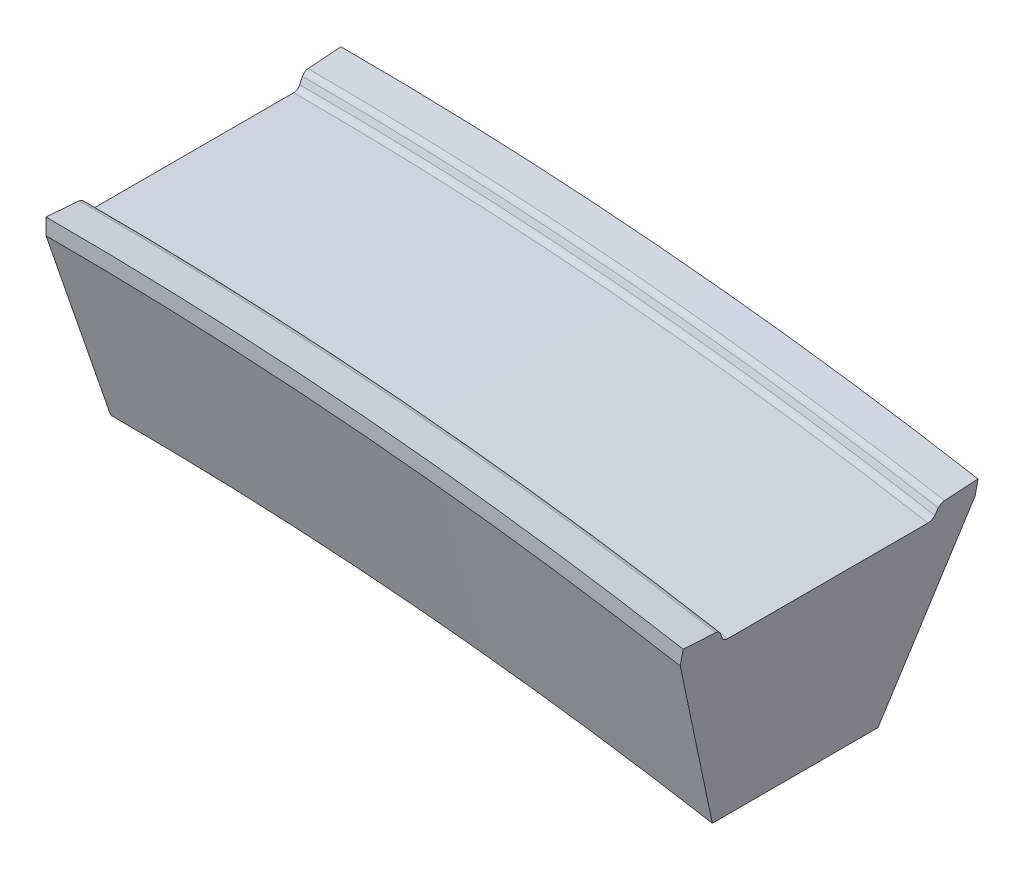
ISO-10303-21;
HEADER;
FILE_DESCRIPTION(('STEP AP214'),'2;1');
FILE_NAME('part.step','',(''),(''),'','','');
FILE_SCHEMA(('AUTOMOTIVE_DESIGN { 1 0 10303 214 1 1 1 1 }'));
ENDSEC;
DATA;
#1=APPLICATION_CONTEXT('core data for automotive mechanical design processes');
#2=APPLICATION_PROTOCOL_DEFINITION('international standard','automotive_design',2000,#1);
#3=PRODUCT_CONTEXT('',#1,'mechanical');
#4=PRODUCT('Part','Part','',(#3));
#5=PRODUCT_RELATED_PRODUCT_CATEGORY('part','',(#4));
#6=PRODUCT_DEFINITION_FORMATION('','',#4);
#7=PRODUCT_DEFINITION_CONTEXT('part definition',#1,'design');
#8=PRODUCT_DEFINITION('design','',#6,#7);
#9=PRODUCT_DEFINITION_SHAPE('','',#8);
#10=(LENGTH_UNIT() NAMED_UNIT(*) SI_UNIT(.MILLI.,.METRE.));
#11=(NAMED_UNIT(*) PLANE_ANGLE_UNIT() SI_UNIT($,.RADIAN.));
#12=(NAMED_UNIT(*) SI_UNIT($,.STERADIAN.) SOLID_ANGLE_UNIT());
#13=UNCERTAINTY_MEASURE_WITH_UNIT(LENGTH_MEASURE(1.E-05),#10,'distance_accuracy_value','');
#14=(GEOMETRIC_REPRESENTATION_CONTEXT(3) GLOBAL_UNCERTAINTY_ASSIGNED_CONTEXT((#13)) GLOBAL_UNIT_ASSIGNED_CONTEXT((#10,
#11,#12)) REPRESENTATION_CONTEXT('',''));
#15=CARTESIAN_POINT('',(0.,0.,0.));
#16=DIRECTION('',(0.,0.,1.));
#17=DIRECTION('',(1.,0.,0.));
#18=AXIS2_PLACEMENT_3D('',#15,#16,#17);
#19=CARTESIAN_POINT('',(0.,0.,11.));
#20=DIRECTION('',(0.,0.,1.));
#21=DIRECTION('',(0.,-1.,0.));
#22=AXIS2_PLACEMENT_3D('',#19,#20,#21);
#23=PLANE('',#22);
#24=CARTESIAN_POINT('',(0.,0.,11.));
#25=DIRECTION('',(0.,0.,1.));
#26=DIRECTION('',(0.,-1.,0.));
#27=AXIS2_PLACEMENT_3D('',#24,#25,#26);
#28=CIRCLE('',#27,272.5);
#29=CARTESIAN_POINT('',(47.3191284142386,268.360112695827,11.0000000000001));
#30=VERTEX_POINT('',#29);
#31=CARTESIAN_POINT('',(0.,272.5,11.0000000000001));
#32=VERTEX_POINT('',#31);
#33=EDGE_CURVE('E11',#30,#32,#28,.T.);
#34=ORIENTED_EDGE('',*,*,#33,.F.);
#35=DIRECTION('',(0.173648177666931,0.984807753012208,0.));
#36=VECTOR('',#35,1.);
#37=CARTESIAN_POINT('',(0.,0.,11.0000000000001));
#38=LINE('',#37,#36);
#39=CARTESIAN_POINT('',(47.5295098602582,269.553245165822,11.0000000000001));
#40=VERTEX_POINT('',#39);
#41=EDGE_CURVE('E196',#30,#40,#38,.T.);
#42=ORIENTED_EDGE('',*,*,#41,.T.);
#43=CARTESIAN_POINT('',(0.,0.,11.));
#44=DIRECTION('',(0.,0.,1.));
#45=DIRECTION('',(0.,-1.,0.));
#46=AXIS2_PLACEMENT_3D('',#43,#44,#45);
#47=CIRCLE('',#46,273.711538461538);
#48=CARTESIAN_POINT('',(0.,273.711538461538,11.0000000000001));
#49=VERTEX_POINT('',#48);
#50=EDGE_CURVE('E58',#40,#49,#47,.T.);
#51=ORIENTED_EDGE('',*,*,#50,.T.);
#52=DIRECTION('',(0.,1.,0.));
#53=VECTOR('',#52,1.);
#54=CARTESIAN_POINT('',(0.,0.,11.0000000000001));
#55=LINE('',#54,#53);
#56=EDGE_CURVE('E154',#32,#49,#55,.T.);
#57=ORIENTED_EDGE('',*,*,#56,.F.);
#58=EDGE_LOOP('',(#34,#42,#51,#57));
#59=FACE_BOUND('',#58,.T.);
#60=ADVANCED_FACE('F43',(#59),#23,.T.);
#61=CARTESIAN_POINT('',(0.,0.,11.));
#62=DIRECTION('',(0.,0.,1.));
#63=DIRECTION('',(0.,-1.,0.));
#64=AXIS2_PLACEMENT_3D('',#61,#62,#63);
#65=CONICAL_SURFACE('',#64,272.5,1.23918376891597);
#66=CARTESIAN_POINT('',(0.,0.,6.17941341394468));
#67=DIRECTION('',(0.,0.,1.));
#68=DIRECTION('',(0.,-1.,0.));
#69=AXIS2_PLACEMENT_3D('',#66,#67,#68);
#70=CIRCLE('',#69,258.5);
#71=CARTESIAN_POINT('',(44.8880539269016,254.572804153656,6.17941341394473));
#72=VERTEX_POINT('',#71);
#73=CARTESIAN_POINT('',(0.,258.5,6.17941341394473));
#74=VERTEX_POINT('',#73);
#75=EDGE_CURVE('E51',#72,#74,#70,.T.);
#76=ORIENTED_EDGE('',*,*,#75,.F.);
#77=DIRECTION('',(-0.164187577603053,-0.931154023867266,-0.325568154457159));
#78=VECTOR('',#77,1.);
#79=CARTESIAN_POINT('',(4.42757647338544,25.110033958478,-74.0498168682843));
#80=LINE('',#79,#78);
#81=EDGE_CURVE('E150',#30,#72,#80,.T.);
#82=ORIENTED_EDGE('',*,*,#81,.F.);
#83=ORIENTED_EDGE('',*,*,#33,.T.);
#84=DIRECTION('',(0.,-0.945518575599316,-0.325568154457159));
#85=VECTOR('',#84,1.);
#86=CARTESIAN_POINT('',(0.,25.4973967067933,-74.0498168682843));
#87=LINE('',#86,#85);
#88=EDGE_CURVE('E147',#32,#74,#87,.T.);
#89=ORIENTED_EDGE('',*,*,#88,.T.);
#90=EDGE_LOOP('',(#76,#82,#83,#89));
#91=FACE_BOUND('',#90,.T.);
#92=ADVANCED_FACE('F45',(#91),#65,.F.);
#93=CARTESIAN_POINT('',(0.,0.,417.631684513944));
#94=DIRECTION('',(0.,0.,1.));
#95=DIRECTION('',(0.,-1.,0.));
#96=AXIS2_PLACEMENT_3D('',#93,#94,#95);
#97=CYLINDRICAL_SURFACE('',#96,258.5);
#98=CARTESIAN_POINT('',(0.,0.,-6.17941341394479));
#99=DIRECTION('',(0.,0.,1.));
#100=DIRECTION('',(0.,-1.,0.));
#101=AXIS2_PLACEMENT_3D('',#98,#99,#100);
#102=CIRCLE('',#101,258.5);
#103=CARTESIAN_POINT('',(44.8880539269016,254.572804153656,-6.17941341394476));
#104=VERTEX_POINT('',#103);
#105=CARTESIAN_POINT('',(0.,258.5,-6.17941341394476));
#106=VERTEX_POINT('',#105);
#107=EDGE_CURVE('E254',#104,#106,#102,.T.);
#108=ORIENTED_EDGE('',*,*,#107,.F.);
#109=DIRECTION('',(0.,0.,-1.));
#110=VECTOR('',#109,1.);
#111=CARTESIAN_POINT('',(44.8880539269016,254.572804153656,0.));
#112=LINE('',#111,#110);
#113=EDGE_CURVE('E199',#72,#104,#112,.T.);
#114=ORIENTED_EDGE('',*,*,#113,.F.);
#115=ORIENTED_EDGE('',*,*,#75,.T.);
#116=DIRECTION('',(0.,0.,-1.));
#117=VECTOR('',#116,1.);
#118=CARTESIAN_POINT('',(0.,258.5,0.));
#119=LINE('',#118,#117);
#120=EDGE_CURVE('E161',#74,#106,#119,.T.);
#121=ORIENTED_EDGE('',*,*,#120,.T.);
#122=EDGE_LOOP('',(#108,#114,#115,#121));
#123=FACE_BOUND('',#122,.T.);
#124=ADVANCED_FACE('F257',(#123),#97,.F.);
#125=CARTESIAN_POINT('',(0.,0.,-6.17941341394479));
#126=DIRECTION('',(0.,0.,-1.));
#127=DIRECTION('',(0.,1.,0.));
#128=AXIS2_PLACEMENT_3D('',#125,#126,#127);
#129=CONICAL_SURFACE('',#128,258.5,1.23918376891598);
#130=CARTESIAN_POINT('',(0.,0.,-11.));
#131=DIRECTION('',(0.,0.,1.));
#132=DIRECTION('',(0.,-1.,0.));
#133=AXIS2_PLACEMENT_3D('',#130,#131,#132);
#134=CIRCLE('',#133,272.5);
#135=CARTESIAN_POINT('',(47.3191284142386,268.360112695827,-10.9999999999999));
#136=VERTEX_POINT('',#135);
#137=CARTESIAN_POINT('',(0.,272.5,-10.9999999999999));
#138=VERTEX_POINT('',#137);
#139=EDGE_CURVE('E252',#136,#138,#134,.T.);
#140=ORIENTED_EDGE('',*,*,#139,.F.);
#141=DIRECTION('',(0.164187577603054,0.93115402386727,-0.325568154457147));
#142=VECTOR('',#141,1.);
#143=CARTESIAN_POINT('',(4.42757647338512,25.1100339584761,74.0498168682818));
#144=LINE('',#143,#142);
#145=EDGE_CURVE('E202',#104,#136,#144,.T.);
#146=ORIENTED_EDGE('',*,*,#145,.F.);
#147=ORIENTED_EDGE('',*,*,#107,.T.);
#148=DIRECTION('',(0.,0.94551857559932,-0.325568154457147));
#149=VECTOR('',#148,1.);
#150=CARTESIAN_POINT('',(0.,25.4973967067914,74.0498168682818));
#151=LINE('',#150,#149);
#152=EDGE_CURVE('E163',#106,#138,#151,.T.);
#153=ORIENTED_EDGE('',*,*,#152,.T.);
#154=EDGE_LOOP('',(#140,#146,#147,#153));
#155=FACE_BOUND('',#154,.T.);
#156=ADVANCED_FACE('F297',(#155),#129,.F.);
#157=CARTESIAN_POINT('',(0.,0.,-11.));
#158=DIRECTION('',(0.,0.,1.));
#159=DIRECTION('',(0.,-1.,0.));
#160=AXIS2_PLACEMENT_3D('',#157,#158,#159);
#161=PLANE('',#160);
#162=CARTESIAN_POINT('',(0.,0.,-11.));
#163=DIRECTION('',(0.,0.,1.));
#164=DIRECTION('',(0.,-1.,0.));
#165=AXIS2_PLACEMENT_3D('',#162,#163,#164);
#166=CIRCLE('',#165,273.711538461538);
#167=CARTESIAN_POINT('',(47.5295098602581,269.553245165822,-10.9999999999999));
#168=VERTEX_POINT('',#167);
#169=CARTESIAN_POINT('',(0.,273.711538461538,-10.9999999999999));
#170=VERTEX_POINT('',#169);
#171=EDGE_CURVE('E250',#168,#170,#166,.T.);
#172=ORIENTED_EDGE('',*,*,#171,.F.);
#173=DIRECTION('',(0.173648177666931,0.984807753012208,0.));
#174=VECTOR('',#173,1.);
#175=CARTESIAN_POINT('',(0.,0.,-10.9999999999999));
#176=LINE('',#175,#174);
#177=EDGE_CURVE('E205',#136,#168,#176,.T.);
#178=ORIENTED_EDGE('',*,*,#177,.F.);
#179=ORIENTED_EDGE('',*,*,#139,.T.);
#180=DIRECTION('',(0.,1.,0.));
#181=VECTOR('',#180,1.);
#182=CARTESIAN_POINT('',(0.,0.,-10.9999999999999));
#183=LINE('',#182,#181);
#184=EDGE_CURVE('E168',#138,#170,#183,.T.);
#185=ORIENTED_EDGE('',*,*,#184,.T.);
#186=EDGE_LOOP('',(#172,#178,#179,#185));
#187=FACE_BOUND('',#186,.T.);
#188=ADVANCED_FACE('F295',(#187),#161,.F.);
#189=CARTESIAN_POINT('',(0.,0.,-8.5458481953769));
#190=DIRECTION('',(0.,0.,-1.));
#191=DIRECTION('',(0.,1.,0.));
#192=AXIS2_PLACEMENT_3D('',#189,#190,#191);
#193=CONICAL_SURFACE('',#192,273.52275755349,0.0767718912698178);
#194=CARTESIAN_POINT('',(0.,0.,-8.5458481953769));
#195=DIRECTION('',(0.,0.,1.));
#196=DIRECTION('',(0.,-1.,0.));
#197=AXIS2_PLACEMENT_3D('',#194,#195,#196);
#198=CIRCLE('',#197,273.52275755349);
#199=CARTESIAN_POINT('',(47.4967283995973,269.367332263956,-8.54584819537685));
#200=VERTEX_POINT('',#199);
#201=CARTESIAN_POINT('',(0.,273.52275755349,-8.54584819537685));
#202=VERTEX_POINT('',#201);
#203=EDGE_CURVE('E248',#200,#202,#198,.T.);
#204=ORIENTED_EDGE('',*,*,#203,.F.);
#205=DIRECTION('',(0.0133182072647713,0.0755313067305977,-0.99705448550158));
#206=VECTOR('',#205,1.);
#207=CARTESIAN_POINT('',(47.1038557469249,267.13924073143,20.8661764705928));
#208=LINE('',#207,#206);
#209=EDGE_CURVE('E208',#200,#168,#208,.T.);
#210=ORIENTED_EDGE('',*,*,#209,.T.);
#211=ORIENTED_EDGE('',*,*,#171,.T.);
#212=DIRECTION('',(0.,0.0766964988847538,-0.99705448550158));
#213=VECTOR('',#212,1.);
#214=CARTESIAN_POINT('',(0.,271.260294117646,20.8661764705928));
#215=LINE('',#214,#213);
#216=EDGE_CURVE('E171',#202,#170,#215,.T.);
#217=ORIENTED_EDGE('',*,*,#216,.F.);
#218=EDGE_LOOP('',(#204,#210,#211,#217));
#219=FACE_BOUND('',#218,.T.);
#220=ADVANCED_FACE('F291',(#219),#193,.T.);
#221=CARTESIAN_POINT('',(0.,0.,-8.58419644481927));
#222=DIRECTION('',(0.,0.,1.));
#223=DIRECTION('',(0.,-1.,0.));
#224=AXIS2_PLACEMENT_3D('',#221,#222,#223);
#225=TOROIDAL_SURFACE('',#224,273.02423031074,0.499999999999952);
#226=CARTESIAN_POINT('',(0.,0.,-8.1282356922317));
#227=DIRECTION('',(0.,0.,1.));
#228=DIRECTION('',(0.,-1.,0.));
#229=AXIS2_PLACEMENT_3D('',#226,#227,#228);
#230=CIRCLE('',#229,273.229412649404);
#231=CARTESIAN_POINT('',(47.4457895915748,269.078443928105,-8.12823569223166));
#232=VERTEX_POINT('',#231);
#233=CARTESIAN_POINT('',(0.,273.229412649404,-8.12823569223166));
#234=VERTEX_POINT('',#233);
#235=EDGE_CURVE('E246',#232,#234,#230,.T.);
#236=ORIENTED_EDGE('',*,*,#235,.F.);
#237=CARTESIAN_POINT('',(47.4101600523763,268.876378770207,-8.58419644481921));
#238=DIRECTION('',(0.984807753012208,-0.173648177666931,0.));
#239=DIRECTION('',(0.,0.,-1.));
#240=AXIS2_PLACEMENT_3D('',#237,#238,#239);
#241=CIRCLE('',#240,0.499999999999952);
#242=EDGE_CURVE('E211',#200,#232,#241,.T.);
#243=ORIENTED_EDGE('',*,*,#242,.F.);
#244=ORIENTED_EDGE('',*,*,#203,.T.);
#245=CARTESIAN_POINT('',(0.,273.02423031074,-8.58419644481921));
#246=DIRECTION('',(1.,0.,0.));
#247=DIRECTION('',(0.,0.,-1.));
#248=AXIS2_PLACEMENT_3D('',#245,#246,#247);
#249=CIRCLE('',#248,0.499999999999952);
#250=EDGE_CURVE('E174',#202,#234,#249,.T.);
#251=ORIENTED_EDGE('',*,*,#250,.T.);
#252=EDGE_LOOP('',(#236,#243,#244,#251));
#253=FACE_BOUND('',#252,.T.);
#254=ADVANCED_FACE('F287',(#253),#225,.T.);
#255=CARTESIAN_POINT('',(0.,0.,-7.93266794760089));
#256=DIRECTION('',(0.,0.,-1.));
#257=DIRECTION('',(0.,1.,0.));
#258=AXIS2_PLACEMENT_3D('',#255,#256,#257);
#259=CONICAL_SURFACE('',#258,272.794817661336,1.14794240066196);
#260=CARTESIAN_POINT('',(0.,0.,-7.93266794760089));
#261=DIRECTION('',(0.,0.,1.));
#262=DIRECTION('',(0.,-1.,0.));
#263=AXIS2_PLACEMENT_3D('',#260,#261,#262);
#264=CIRCLE('',#263,272.794817661336);
#265=CARTESIAN_POINT('',(47.3703229638736,268.650451414435,-7.93266794760085));
#266=VERTEX_POINT('',#265);
#267=CARTESIAN_POINT('',(0.,272.794817661336,-7.93266794760085));
#268=VERTEX_POINT('',#267);
#269=EDGE_CURVE('E244',#266,#268,#264,.T.);
#270=ORIENTED_EDGE('',*,*,#269,.F.);
#271=DIRECTION('',(0.158353507548941,0.898067368435002,-0.41036467732881));
#272=VECTOR('',#271,1.);
#273=CARTESIAN_POINT('',(7.46163692330391,42.3170458277216,95.4885654885681));
#274=LINE('',#273,#272);
#275=EDGE_CURVE('E214',#266,#232,#274,.T.);
#276=ORIENTED_EDGE('',*,*,#275,.T.);
#277=ORIENTED_EDGE('',*,*,#235,.T.);
#278=DIRECTION('',(0.,0.911921505175101,-0.41036467732881));
#279=VECTOR('',#278,1.);
#280=CARTESIAN_POINT('',(0.,42.9698544698572,95.4885654885681));
#281=LINE('',#280,#279);
#282=EDGE_CURVE('E177',#268,#234,#281,.T.);
#283=ORIENTED_EDGE('',*,*,#282,.F.);
#284=EDGE_LOOP('',(#270,#276,#277,#283));
#285=FACE_BOUND('',#284,.T.);
#286=ADVANCED_FACE('F284',(#285),#259,.T.);
#287=CARTESIAN_POINT('',(0.,0.,-7.47670719501332));
#288=DIRECTION('',(0.,0.,1.));
#289=DIRECTION('',(0.,-1.,0.));
#290=AXIS2_PLACEMENT_3D('',#287,#288,#289);
#291=TOROIDAL_SURFACE('',#290,273.,0.500000000000009);
#292=CARTESIAN_POINT('',(0.,0.,-7.47670719501337));
#293=DIRECTION('',(0.,0.,1.));
#294=DIRECTION('',(0.,-1.,0.));
#295=AXIS2_PLACEMENT_3D('',#292,#293,#294);
#296=CIRCLE('',#295,272.5);
#297=CARTESIAN_POINT('',(47.3191284142386,268.360112695827,-7.47670719501329));
#298=VERTEX_POINT('',#297);
#299=CARTESIAN_POINT('',(0.,272.5,-7.47670719501329));
#300=VERTEX_POINT('',#299);
#301=EDGE_CURVE('E242',#298,#300,#296,.T.);
#302=ORIENTED_EDGE('',*,*,#301,.F.);
#303=CARTESIAN_POINT('',(47.4059525030721,268.852516572333,-7.47670719501326));
#304=DIRECTION('',(0.984807753012208,-0.173648177666931,0.));
#305=DIRECTION('',(0.,0.,-1.));
#306=AXIS2_PLACEMENT_3D('',#303,#304,#305);
#307=CIRCLE('',#306,0.500000000000009);
#308=EDGE_CURVE('E217',#298,#266,#307,.T.);
#309=ORIENTED_EDGE('',*,*,#308,.T.);
#310=ORIENTED_EDGE('',*,*,#269,.T.);
#311=CARTESIAN_POINT('',(0.,273.,-7.47670719501326));
#312=DIRECTION('',(1.,0.,0.));
#313=DIRECTION('',(0.,0.,-1.));
#314=AXIS2_PLACEMENT_3D('',#311,#312,#313);
#315=CIRCLE('',#314,0.500000000000009);
#316=EDGE_CURVE('E180',#300,#268,#315,.T.);
#317=ORIENTED_EDGE('',*,*,#316,.F.);
#318=EDGE_LOOP('',(#302,#309,#310,#317));
#319=FACE_BOUND('',#318,.T.);
#320=ADVANCED_FACE('F280',(#319),#291,.F.);
#321=CARTESIAN_POINT('',(0.,0.,417.631684513944));
#322=DIRECTION('',(0.,0.,1.));
#323=DIRECTION('',(0.,-1.,0.));
#324=AXIS2_PLACEMENT_3D('',#321,#322,#323);
#325=CYLINDRICAL_SURFACE('',#324,272.5);
#326=CARTESIAN_POINT('',(0.,0.,7.47670719501342));
#327=DIRECTION('',(0.,0.,1.));
#328=DIRECTION('',(0.,-1.,0.));
#329=AXIS2_PLACEMENT_3D('',#326,#327,#328);
#330=CIRCLE('',#329,272.5);
#331=CARTESIAN_POINT('',(47.3191284142386,268.360112695827,7.47670719501345));
#332=VERTEX_POINT('',#331);
#333=CARTESIAN_POINT('',(0.,272.5,7.47670719501345));
#334=VERTEX_POINT('',#333);
#335=EDGE_CURVE('E240',#332,#334,#330,.T.);
#336=ORIENTED_EDGE('',*,*,#335,.F.);
#337=DIRECTION('',(0.,0.,-1.));
#338=VECTOR('',#337,1.);
#339=CARTESIAN_POINT('',(47.3191284142386,268.360112695827,0.));
#340=LINE('',#339,#338);
#341=EDGE_CURVE('E220',#332,#298,#340,.T.);
#342=ORIENTED_EDGE('',*,*,#341,.T.);
#343=ORIENTED_EDGE('',*,*,#301,.T.);
#344=DIRECTION('',(0.,0.,-1.));
#345=VECTOR('',#344,1.);
#346=CARTESIAN_POINT('',(0.,272.5,0.));
#347=LINE('',#346,#345);
#348=EDGE_CURVE('E183',#334,#300,#347,.T.);
#349=ORIENTED_EDGE('',*,*,#348,.F.);
#350=EDGE_LOOP('',(#336,#342,#343,#349));
#351=FACE_BOUND('',#350,.T.);
#352=ADVANCED_FACE('F275',(#351),#325,.T.);
#353=CARTESIAN_POINT('',(0.,0.,7.47670719501341));
#354=DIRECTION('',(0.,0.,1.));
#355=DIRECTION('',(0.,-1.,0.));
#356=AXIS2_PLACEMENT_3D('',#353,#354,#355);
#357=TOROIDAL_SURFACE('',#356,273.,0.500000000000002);
#358=CARTESIAN_POINT('',(0.,0.,7.932667947601));
#359=DIRECTION('',(0.,0.,1.));
#360=DIRECTION('',(0.,-1.,0.));
#361=AXIS2_PLACEMENT_3D('',#358,#359,#360);
#362=CIRCLE('',#361,272.794817661336);
#363=CARTESIAN_POINT('',(47.3703229638736,268.650451414435,7.93266794760104));
#364=VERTEX_POINT('',#363);
#365=CARTESIAN_POINT('',(0.,272.794817661336,7.93266794760104));
#366=VERTEX_POINT('',#365);
#367=EDGE_CURVE('E238',#364,#366,#362,.T.);
#368=ORIENTED_EDGE('',*,*,#367,.F.);
#369=CARTESIAN_POINT('',(47.4059525030721,268.852516572333,7.47670719501347));
#370=DIRECTION('',(0.984807753012208,-0.173648177666931,0.));
#371=DIRECTION('',(0.,0.,-1.));
#372=AXIS2_PLACEMENT_3D('',#369,#370,#371);
#373=CIRCLE('',#372,0.500000000000002);
#374=EDGE_CURVE('E223',#364,#332,#373,.T.);
#375=ORIENTED_EDGE('',*,*,#374,.T.);
#376=ORIENTED_EDGE('',*,*,#335,.T.);
#377=CARTESIAN_POINT('',(0.,273.,7.47670719501347));
#378=DIRECTION('',(1.,0.,0.));
#379=DIRECTION('',(0.,0.,-1.));
#380=AXIS2_PLACEMENT_3D('',#377,#378,#379);
#381=CIRCLE('',#380,0.500000000000002);
#382=EDGE_CURVE('E186',#366,#334,#381,.T.);
#383=ORIENTED_EDGE('',*,*,#382,.F.);
#384=EDGE_LOOP('',(#368,#375,#376,#383));
#385=FACE_BOUND('',#384,.T.);
#386=ADVANCED_FACE('F271',(#385),#357,.F.);
#387=CARTESIAN_POINT('',(0.,0.,7.932667947601));
#388=DIRECTION('',(0.,0.,1.));
#389=DIRECTION('',(0.,-1.,0.));
#390=AXIS2_PLACEMENT_3D('',#387,#388,#389);
#391=CONICAL_SURFACE('',#390,272.794817661336,1.14794240066192);
#392=CARTESIAN_POINT('',(0.,0.,8.12823569223175));
#393=DIRECTION('',(0.,0.,1.));
#394=DIRECTION('',(0.,-1.,0.));
#395=AXIS2_PLACEMENT_3D('',#392,#393,#394);
#396=CIRCLE('',#395,273.229412649404);
#397=CARTESIAN_POINT('',(47.4457895915748,269.078443928105,8.12823569223181));
#398=VERTEX_POINT('',#397);
#399=CARTESIAN_POINT('',(0.,273.229412649404,8.12823569223181));
#400=VERTEX_POINT('',#399);
#401=EDGE_CURVE('E236',#398,#400,#396,.T.);
#402=ORIENTED_EDGE('',*,*,#401,.F.);
#403=DIRECTION('',(0.15835350754894,0.898067368434995,0.410364677328824));
#404=VECTOR('',#403,1.);
#405=CARTESIAN_POINT('',(7.46163692330444,42.3170458277247,-95.4885654885709));
#406=LINE('',#405,#404);
#407=EDGE_CURVE('E226',#364,#398,#406,.T.);
#408=ORIENTED_EDGE('',*,*,#407,.F.);
#409=ORIENTED_EDGE('',*,*,#367,.T.);
#410=DIRECTION('',(0.,0.911921505175094,0.410364677328824));
#411=VECTOR('',#410,1.);
#412=CARTESIAN_POINT('',(0.,42.9698544698603,-95.4885654885709));
#413=LINE('',#412,#411);
#414=EDGE_CURVE('E189',#366,#400,#413,.T.);
#415=ORIENTED_EDGE('',*,*,#414,.T.);
#416=EDGE_LOOP('',(#402,#408,#409,#415));
#417=FACE_BOUND('',#416,.T.);
#418=ADVANCED_FACE('F267',(#417),#391,.T.);
#419=CARTESIAN_POINT('',(0.,0.,8.58419644481936));
#420=DIRECTION('',(0.,0.,1.));
#421=DIRECTION('',(0.,-1.,0.));
#422=AXIS2_PLACEMENT_3D('',#419,#420,#421);
#423=TOROIDAL_SURFACE('',#422,273.02423031074,0.499999999999959);
#424=CARTESIAN_POINT('',(0.,0.,8.5458481953769));
#425=DIRECTION('',(0.,0.,1.));
#426=DIRECTION('',(0.,-1.,0.));
#427=AXIS2_PLACEMENT_3D('',#424,#425,#426);
#428=CIRCLE('',#427,273.52275755349);
#429=CARTESIAN_POINT('',(47.4967283995973,269.367332263956,8.54584819537697));
#430=VERTEX_POINT('',#429);
#431=CARTESIAN_POINT('',(0.,273.52275755349,8.54584819537697));
#432=VERTEX_POINT('',#431);
#433=EDGE_CURVE('E66',#430,#432,#428,.T.);
#434=ORIENTED_EDGE('',*,*,#433,.F.);
#435=CARTESIAN_POINT('',(47.4101600523763,268.876378770207,8.58419644481942));
#436=DIRECTION('',(0.984807753012208,-0.173648177666931,0.));
#437=DIRECTION('',(0.,0.,-1.));
#438=AXIS2_PLACEMENT_3D('',#435,#436,#437);
#439=CIRCLE('',#438,0.499999999999959);
#440=EDGE_CURVE('E229',#398,#430,#439,.T.);
#441=ORIENTED_EDGE('',*,*,#440,.F.);
#442=ORIENTED_EDGE('',*,*,#401,.T.);
#443=CARTESIAN_POINT('',(0.,273.02423031074,8.58419644481942));
#444=DIRECTION('',(1.,0.,0.));
#445=DIRECTION('',(0.,0.,-1.));
#446=AXIS2_PLACEMENT_3D('',#443,#444,#445);
#447=CIRCLE('',#446,0.499999999999959);
#448=EDGE_CURVE('E192',#400,#432,#447,.T.);
#449=ORIENTED_EDGE('',*,*,#448,.T.);
#450=EDGE_LOOP('',(#434,#441,#442,#449));
#451=FACE_BOUND('',#450,.T.);
#452=ADVANCED_FACE('F263',(#451),#423,.T.);
#453=CARTESIAN_POINT('',(0.,0.,8.5458481953769));
#454=DIRECTION('',(0.,0.,1.));
#455=DIRECTION('',(0.,-1.,0.));
#456=AXIS2_PLACEMENT_3D('',#453,#454,#455);
#457=CONICAL_SURFACE('',#456,273.52275755349,0.0767718912697936);
#458=DIRECTION('',(0.0133182072647711,0.0755313067305963,0.997054485501581));
#459=VECTOR('',#458,1.);
#460=CARTESIAN_POINT('',(47.1038557469249,267.13924073143,-20.8661764705924));
#461=LINE('',#460,#459);
#462=EDGE_CURVE('E231',#430,#40,#461,.T.);
#463=ORIENTED_EDGE('',*,*,#462,.F.);
#464=ORIENTED_EDGE('',*,*,#433,.T.);
#465=DIRECTION('',(0.,0.0766964988847524,0.997054485501581));
#466=VECTOR('',#465,1.);
#467=CARTESIAN_POINT('',(0.,271.260294117646,-20.8661764705924));
#468=LINE('',#467,#466);
#469=EDGE_CURVE('E194',#432,#49,#468,.T.);
#470=ORIENTED_EDGE('',*,*,#469,.T.);
#471=ORIENTED_EDGE('',*,*,#50,.F.);
#472=EDGE_LOOP('',(#463,#464,#470,#471));
#473=FACE_BOUND('',#472,.T.);
#474=ADVANCED_FACE('F261',(#473),#457,.T.);
#475=CARTESIAN_POINT('',(0.,0.,0.));
#476=DIRECTION('',(0.984807753012208,-0.173648177666931,0.));
#477=DIRECTION('',(0.,0.,-1.));
#478=AXIS2_PLACEMENT_3D('',#475,#476,#477);
#479=PLANE('',#478);
#480=ORIENTED_EDGE('',*,*,#41,.F.);
#481=ORIENTED_EDGE('',*,*,#81,.T.);
#482=ORIENTED_EDGE('',*,*,#113,.T.);
#483=ORIENTED_EDGE('',*,*,#145,.T.);
#484=ORIENTED_EDGE('',*,*,#177,.T.);
#485=ORIENTED_EDGE('',*,*,#209,.F.);
#486=ORIENTED_EDGE('',*,*,#242,.T.);
#487=ORIENTED_EDGE('',*,*,#275,.F.);
#488=ORIENTED_EDGE('',*,*,#308,.F.);
#489=ORIENTED_EDGE('',*,*,#341,.F.);
#490=ORIENTED_EDGE('',*,*,#374,.F.);
#491=ORIENTED_EDGE('',*,*,#407,.T.);
#492=ORIENTED_EDGE('',*,*,#440,.T.);
#493=ORIENTED_EDGE('',*,*,#462,.T.);
#494=EDGE_LOOP('',(#480,#481,#482,#483,#484,#485,#486,#487,#488,#489,#490,#491,#492,#493));
#495=FACE_BOUND('',#494,.T.);
#496=ADVANCED_FACE('F259',(#495),#479,.T.);
#497=CARTESIAN_POINT('',(0.,0.,0.));
#498=DIRECTION('',(1.,0.,0.));
#499=DIRECTION('',(0.,0.,-1.));
#500=AXIS2_PLACEMENT_3D('',#497,#498,#499);
#501=PLANE('',#500);
#502=ORIENTED_EDGE('',*,*,#56,.T.);
#503=ORIENTED_EDGE('',*,*,#469,.F.);
#504=ORIENTED_EDGE('',*,*,#448,.F.);
#505=ORIENTED_EDGE('',*,*,#414,.F.);
#506=ORIENTED_EDGE('',*,*,#382,.T.);
#507=ORIENTED_EDGE('',*,*,#348,.T.);
#508=ORIENTED_EDGE('',*,*,#316,.T.);
#509=ORIENTED_EDGE('',*,*,#282,.T.);
#510=ORIENTED_EDGE('',*,*,#250,.F.);
#511=ORIENTED_EDGE('',*,*,#216,.T.);
#512=ORIENTED_EDGE('',*,*,#184,.F.);
#513=ORIENTED_EDGE('',*,*,#152,.F.);
#514=ORIENTED_EDGE('',*,*,#120,.F.);
#515=ORIENTED_EDGE('',*,*,#88,.F.);
#516=EDGE_LOOP('',(#502,#503,#504,#505,#506,#507,#508,#509,#510,#511,#512,#513,#514,#515));
#517=FACE_BOUND('',#516,.T.);
#518=ADVANCED_FACE('F158',(#517),#501,.F.);
#519=CLOSED_SHELL('',(#60,#92,#124,#156,#188,#220,#254,#286,#320,#352,#386,#418,#452,#474,#496,#518));
#520=MANIFOLD_SOLID_BREP('B2',#519);
#521=ADVANCED_BREP_SHAPE_REPRESENTATION('',(#18,#520),#14);
#522=SHAPE_DEFINITION_REPRESENTATION(#9,#521);
ENDSEC;
END-ISO-10303-21;
